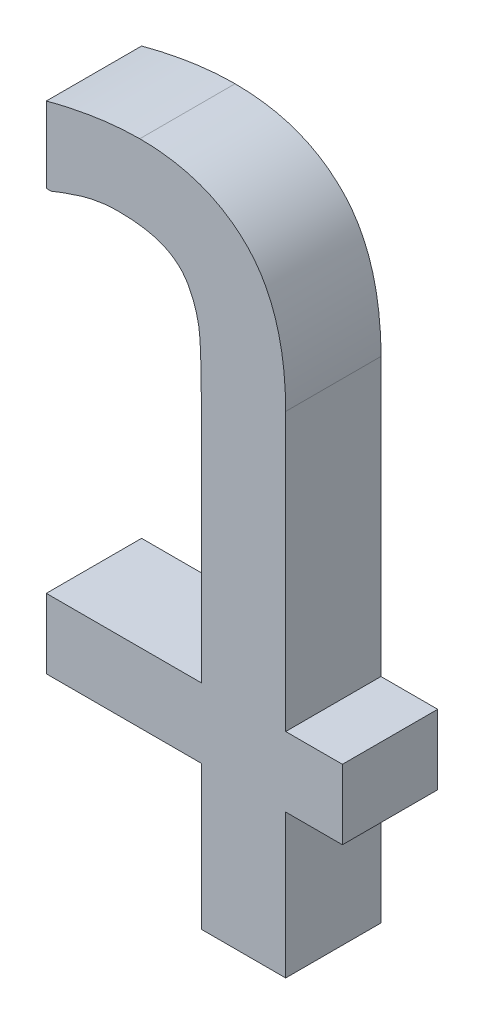
ISO-10303-21;
HEADER;
FILE_DESCRIPTION(('STEP AP214'),'2;1');
FILE_NAME('part.step','',(''),(''),'','','');
FILE_SCHEMA(('AUTOMOTIVE_DESIGN { 1 0 10303 214 1 1 1 1 }'));
ENDSEC;
DATA;
#1=APPLICATION_CONTEXT('core data for automotive mechanical design processes');
#2=APPLICATION_PROTOCOL_DEFINITION('international standard','automotive_design',2000,#1);
#3=PRODUCT_CONTEXT('',#1,'mechanical');
#4=PRODUCT('Part','Part','',(#3));
#5=PRODUCT_RELATED_PRODUCT_CATEGORY('part','',(#4));
#6=PRODUCT_DEFINITION_FORMATION('','',#4);
#7=PRODUCT_DEFINITION_CONTEXT('part definition',#1,'design');
#8=PRODUCT_DEFINITION('design','',#6,#7);
#9=PRODUCT_DEFINITION_SHAPE('','',#8);
#10=(LENGTH_UNIT() NAMED_UNIT(*) SI_UNIT(.MILLI.,.METRE.));
#11=(NAMED_UNIT(*) PLANE_ANGLE_UNIT() SI_UNIT($,.RADIAN.));
#12=(NAMED_UNIT(*) SI_UNIT($,.STERADIAN.) SOLID_ANGLE_UNIT());
#13=UNCERTAINTY_MEASURE_WITH_UNIT(LENGTH_MEASURE(1.E-05),#10,'distance_accuracy_value','');
#14=(GEOMETRIC_REPRESENTATION_CONTEXT(3) GLOBAL_UNCERTAINTY_ASSIGNED_CONTEXT((#13)) GLOBAL_UNIT_ASSIGNED_CONTEXT((#10,
#11,#12)) REPRESENTATION_CONTEXT('',''));
#15=CARTESIAN_POINT('',(0.,0.,0.));
#16=DIRECTION('',(0.,0.,1.));
#17=DIRECTION('',(1.,0.,0.));
#18=AXIS2_PLACEMENT_3D('',#15,#16,#17);
#19=CARTESIAN_POINT('',(-1.909136508596,0.83236047618164,0.));
#20=DIRECTION('',(1.,0.,0.));
#21=DIRECTION('',(0.,1.,0.));
#22=AXIS2_PLACEMENT_3D('',#19,#20,#21);
#23=PLANE('',#22);
#24=DIRECTION('',(0.,-1.,0.));
#25=VECTOR('',#24,1.);
#26=CARTESIAN_POINT('',(-1.909136508596,1.12329883924,0.));
#27=LINE('',#26,#25);
#28=CARTESIAN_POINT('',(-1.909136508596,1.12329883924,0.));
#29=VERTEX_POINT('',#28);
#30=CARTESIAN_POINT('',(-1.909136508596,0.83236047618164,0.));
#31=VERTEX_POINT('',#30);
#32=EDGE_CURVE('E11',#29,#31,#27,.T.);
#33=ORIENTED_EDGE('',*,*,#32,.F.);
#34=DIRECTION('',(0.,0.,1.));
#35=VECTOR('',#34,1.);
#36=CARTESIAN_POINT('',(-1.909136508596,1.12329883924,0.));
#37=LINE('',#36,#35);
#38=CARTESIAN_POINT('',(-1.909136508596,1.12329883924,0.1));
#39=VERTEX_POINT('',#38);
#40=EDGE_CURVE('E24',#29,#39,#37,.T.);
#41=ORIENTED_EDGE('',*,*,#40,.T.);
#42=DIRECTION('',(0.,1.,0.));
#43=VECTOR('',#42,1.);
#44=CARTESIAN_POINT('',(-1.909136508596,1.12329883924,0.1));
#45=LINE('',#44,#43);
#46=CARTESIAN_POINT('',(-1.909136508596,0.83236047618164,0.1));
#47=VERTEX_POINT('',#46);
#48=EDGE_CURVE('E160',#47,#39,#45,.T.);
#49=ORIENTED_EDGE('',*,*,#48,.F.);
#50=DIRECTION('',(0.,0.,1.));
#51=VECTOR('',#50,1.);
#52=CARTESIAN_POINT('',(-1.909136508596,0.83236047618164,0.));
#53=LINE('',#52,#51);
#54=EDGE_CURVE('E331',#31,#47,#53,.T.);
#55=ORIENTED_EDGE('',*,*,#54,.F.);
#56=EDGE_LOOP('',(#33,#41,#49,#55));
#57=FACE_BOUND('',#56,.T.);
#58=ADVANCED_FACE('F17',(#57),#23,.T.);
#59=CARTESIAN_POINT('',(-1.849587720835,0.83236047618164,0.));
#60=DIRECTION('',(0.,1.,0.));
#61=DIRECTION('',(-1.,0.,0.));
#62=AXIS2_PLACEMENT_3D('',#59,#60,#61);
#63=PLANE('',#62);
#64=DIRECTION('',(1.,0.,0.));
#65=VECTOR('',#64,1.);
#66=CARTESIAN_POINT('',(-1.909136508596,0.83236047618164,0.));
#67=LINE('',#66,#65);
#68=CARTESIAN_POINT('',(-1.849587720835,0.83236047618164,0.));
#69=VERTEX_POINT('',#68);
#70=EDGE_CURVE('E329',#31,#69,#67,.T.);
#71=ORIENTED_EDGE('',*,*,#70,.F.);
#72=ORIENTED_EDGE('',*,*,#54,.T.);
#73=DIRECTION('',(-1.,0.,0.));
#74=VECTOR('',#73,1.);
#75=CARTESIAN_POINT('',(-1.909136508596,0.83236047618164,0.1));
#76=LINE('',#75,#74);
#77=CARTESIAN_POINT('',(-1.849587720835,0.83236047618164,0.1));
#78=VERTEX_POINT('',#77);
#79=EDGE_CURVE('E327',#78,#47,#76,.T.);
#80=ORIENTED_EDGE('',*,*,#79,.F.);
#81=DIRECTION('',(0.,0.,1.));
#82=VECTOR('',#81,1.);
#83=CARTESIAN_POINT('',(-1.849587720835,0.83236047618164,0.));
#84=LINE('',#83,#82);
#85=EDGE_CURVE('E324',#69,#78,#84,.T.);
#86=ORIENTED_EDGE('',*,*,#85,.F.);
#87=EDGE_LOOP('',(#71,#72,#80,#86));
#88=FACE_BOUND('',#87,.T.);
#89=ADVANCED_FACE('F393',(#88),#63,.T.);
#90=CARTESIAN_POINT('',(-1.849587720835,0.759200536932928,0.));
#91=DIRECTION('',(1.,0.,0.));
#92=DIRECTION('',(0.,1.,0.));
#93=AXIS2_PLACEMENT_3D('',#90,#91,#92);
#94=PLANE('',#93);
#95=DIRECTION('',(0.,-1.,0.));
#96=VECTOR('',#95,1.);
#97=CARTESIAN_POINT('',(-1.849587720835,0.83236047618164,0.));
#98=LINE('',#97,#96);
#99=CARTESIAN_POINT('',(-1.849587720835,0.759200536932928,0.));
#100=VERTEX_POINT('',#99);
#101=EDGE_CURVE('E322',#69,#100,#98,.T.);
#102=ORIENTED_EDGE('',*,*,#101,.F.);
#103=ORIENTED_EDGE('',*,*,#85,.T.);
#104=DIRECTION('',(0.,1.,0.));
#105=VECTOR('',#104,1.);
#106=CARTESIAN_POINT('',(-1.849587720835,0.83236047618164,0.1));
#107=LINE('',#106,#105);
#108=CARTESIAN_POINT('',(-1.849587720835,0.759200536932928,0.1));
#109=VERTEX_POINT('',#108);
#110=EDGE_CURVE('E319',#109,#78,#107,.T.);
#111=ORIENTED_EDGE('',*,*,#110,.F.);
#112=DIRECTION('',(0.,0.,1.));
#113=VECTOR('',#112,1.);
#114=CARTESIAN_POINT('',(-1.849587720835,0.759200536932928,0.));
#115=LINE('',#114,#113);
#116=EDGE_CURVE('E316',#100,#109,#115,.T.);
#117=ORIENTED_EDGE('',*,*,#116,.F.);
#118=EDGE_LOOP('',(#102,#103,#111,#117));
#119=FACE_BOUND('',#118,.T.);
#120=ADVANCED_FACE('F389',(#119),#94,.T.);
#121=CARTESIAN_POINT('',(-1.909136508596,0.759200536932928,0.));
#122=DIRECTION('',(0.,-1.,0.));
#123=DIRECTION('',(1.,0.,0.));
#124=AXIS2_PLACEMENT_3D('',#121,#122,#123);
#125=PLANE('',#124);
#126=DIRECTION('',(-1.,0.,0.));
#127=VECTOR('',#126,1.);
#128=CARTESIAN_POINT('',(-1.849587720835,0.759200536932928,0.));
#129=LINE('',#128,#127);
#130=CARTESIAN_POINT('',(-1.909136508596,0.759200536932928,0.));
#131=VERTEX_POINT('',#130);
#132=EDGE_CURVE('E314',#100,#131,#129,.T.);
#133=ORIENTED_EDGE('',*,*,#132,.F.);
#134=ORIENTED_EDGE('',*,*,#116,.T.);
#135=DIRECTION('',(1.,0.,0.));
#136=VECTOR('',#135,1.);
#137=CARTESIAN_POINT('',(-1.849587720835,0.759200536932928,0.1));
#138=LINE('',#137,#136);
#139=CARTESIAN_POINT('',(-1.909136508596,0.759200536932928,0.1));
#140=VERTEX_POINT('',#139);
#141=EDGE_CURVE('E311',#140,#109,#138,.T.);
#142=ORIENTED_EDGE('',*,*,#141,.F.);
#143=DIRECTION('',(0.,0.,1.));
#144=VECTOR('',#143,1.);
#145=CARTESIAN_POINT('',(-1.909136508596,0.759200536932928,0.));
#146=LINE('',#145,#144);
#147=EDGE_CURVE('E308',#131,#140,#146,.T.);
#148=ORIENTED_EDGE('',*,*,#147,.F.);
#149=EDGE_LOOP('',(#133,#134,#142,#148));
#150=FACE_BOUND('',#149,.T.);
#151=ADVANCED_FACE('F385',(#150),#125,.T.);
#152=CARTESIAN_POINT('',(-1.909136508596,0.608343607939458,0.));
#153=DIRECTION('',(1.,0.,0.));
#154=DIRECTION('',(0.,1.,0.));
#155=AXIS2_PLACEMENT_3D('',#152,#153,#154);
#156=PLANE('',#155);
#157=DIRECTION('',(0.,-1.,0.));
#158=VECTOR('',#157,1.);
#159=CARTESIAN_POINT('',(-1.909136508596,0.759200536932928,0.));
#160=LINE('',#159,#158);
#161=CARTESIAN_POINT('',(-1.909136508596,0.608343607939458,0.));
#162=VERTEX_POINT('',#161);
#163=EDGE_CURVE('E306',#131,#162,#160,.T.);
#164=ORIENTED_EDGE('',*,*,#163,.F.);
#165=ORIENTED_EDGE('',*,*,#147,.T.);
#166=DIRECTION('',(0.,1.,0.));
#167=VECTOR('',#166,1.);
#168=CARTESIAN_POINT('',(-1.909136508596,0.759200536932928,0.1));
#169=LINE('',#168,#167);
#170=CARTESIAN_POINT('',(-1.909136508596,0.608343607939458,0.1));
#171=VERTEX_POINT('',#170);
#172=EDGE_CURVE('E303',#171,#140,#169,.T.);
#173=ORIENTED_EDGE('',*,*,#172,.F.);
#174=DIRECTION('',(0.,0.,1.));
#175=VECTOR('',#174,1.);
#176=CARTESIAN_POINT('',(-1.909136508596,0.608343607939458,0.));
#177=LINE('',#176,#175);
#178=EDGE_CURVE('E300',#162,#171,#177,.T.);
#179=ORIENTED_EDGE('',*,*,#178,.F.);
#180=EDGE_LOOP('',(#164,#165,#173,#179));
#181=FACE_BOUND('',#180,.T.);
#182=ADVANCED_FACE('F381',(#181),#156,.T.);
#183=CARTESIAN_POINT('',(-1.997608993269,0.608343607939458,0.));
#184=DIRECTION('',(0.,-1.,0.));
#185=DIRECTION('',(1.,0.,0.));
#186=AXIS2_PLACEMENT_3D('',#183,#184,#185);
#187=PLANE('',#186);
#188=DIRECTION('',(-1.,0.,0.));
#189=VECTOR('',#188,1.);
#190=CARTESIAN_POINT('',(-1.909136508596,0.608343607939458,0.));
#191=LINE('',#190,#189);
#192=CARTESIAN_POINT('',(-1.997608993269,0.608343607939458,0.));
#193=VERTEX_POINT('',#192);
#194=EDGE_CURVE('E298',#162,#193,#191,.T.);
#195=ORIENTED_EDGE('',*,*,#194,.F.);
#196=ORIENTED_EDGE('',*,*,#178,.T.);
#197=DIRECTION('',(1.,0.,0.));
#198=VECTOR('',#197,1.);
#199=CARTESIAN_POINT('',(-1.909136508596,0.608343607939458,0.1));
#200=LINE('',#199,#198);
#201=CARTESIAN_POINT('',(-1.997608993269,0.608343607939458,0.1));
#202=VERTEX_POINT('',#201);
#203=EDGE_CURVE('E295',#202,#171,#200,.T.);
#204=ORIENTED_EDGE('',*,*,#203,.F.);
#205=DIRECTION('',(0.,0.,1.));
#206=VECTOR('',#205,1.);
#207=CARTESIAN_POINT('',(-1.997608993269,0.608343607939458,0.));
#208=LINE('',#207,#206);
#209=EDGE_CURVE('E292',#193,#202,#208,.T.);
#210=ORIENTED_EDGE('',*,*,#209,.F.);
#211=EDGE_LOOP('',(#195,#196,#204,#210));
#212=FACE_BOUND('',#211,.T.);
#213=ADVANCED_FACE('F377',(#212),#187,.T.);
#214=CARTESIAN_POINT('',(-1.997608993269,0.759200536932928,0.));
#215=DIRECTION('',(-1.,0.,0.));
#216=DIRECTION('',(0.,-1.,0.));
#217=AXIS2_PLACEMENT_3D('',#214,#215,#216);
#218=PLANE('',#217);
#219=DIRECTION('',(0.,1.,0.));
#220=VECTOR('',#219,1.);
#221=CARTESIAN_POINT('',(-1.997608993269,0.608343607939458,0.));
#222=LINE('',#221,#220);
#223=CARTESIAN_POINT('',(-1.997608993269,0.759200536932928,0.));
#224=VERTEX_POINT('',#223);
#225=EDGE_CURVE('E290',#193,#224,#222,.T.);
#226=ORIENTED_EDGE('',*,*,#225,.F.);
#227=ORIENTED_EDGE('',*,*,#209,.T.);
#228=DIRECTION('',(0.,-1.,0.));
#229=VECTOR('',#228,1.);
#230=CARTESIAN_POINT('',(-1.997608993269,0.608343607939458,0.1));
#231=LINE('',#230,#229);
#232=CARTESIAN_POINT('',(-1.997608993269,0.759200536932928,0.1));
#233=VERTEX_POINT('',#232);
#234=EDGE_CURVE('E287',#233,#202,#231,.T.);
#235=ORIENTED_EDGE('',*,*,#234,.F.);
#236=DIRECTION('',(0.,0.,1.));
#237=VECTOR('',#236,1.);
#238=CARTESIAN_POINT('',(-1.997608993269,0.759200536932928,0.));
#239=LINE('',#238,#237);
#240=EDGE_CURVE('E284',#224,#233,#239,.T.);
#241=ORIENTED_EDGE('',*,*,#240,.F.);
#242=EDGE_LOOP('',(#226,#227,#235,#241));
#243=FACE_BOUND('',#242,.T.);
#244=ADVANCED_FACE('F373',(#243),#218,.T.);
#245=CARTESIAN_POINT('',(-2.160375679814,0.759200536932928,0.));
#246=DIRECTION('',(0.,-1.,0.));
#247=DIRECTION('',(1.,0.,0.));
#248=AXIS2_PLACEMENT_3D('',#245,#246,#247);
#249=PLANE('',#248);
#250=DIRECTION('',(-1.,0.,0.));
#251=VECTOR('',#250,1.);
#252=CARTESIAN_POINT('',(-1.997608993269,0.759200536932928,0.));
#253=LINE('',#252,#251);
#254=CARTESIAN_POINT('',(-2.160375679814,0.759200536932928,0.));
#255=VERTEX_POINT('',#254);
#256=EDGE_CURVE('E282',#224,#255,#253,.T.);
#257=ORIENTED_EDGE('',*,*,#256,.F.);
#258=ORIENTED_EDGE('',*,*,#240,.T.);
#259=DIRECTION('',(1.,0.,0.));
#260=VECTOR('',#259,1.);
#261=CARTESIAN_POINT('',(-1.997608993269,0.759200536932928,0.1));
#262=LINE('',#261,#260);
#263=CARTESIAN_POINT('',(-2.160375679814,0.759200536932928,0.1));
#264=VERTEX_POINT('',#263);
#265=EDGE_CURVE('E279',#264,#233,#262,.T.);
#266=ORIENTED_EDGE('',*,*,#265,.F.);
#267=DIRECTION('',(0.,0.,1.));
#268=VECTOR('',#267,1.);
#269=CARTESIAN_POINT('',(-2.160375679814,0.759200536932928,0.));
#270=LINE('',#269,#268);
#271=EDGE_CURVE('E276',#255,#264,#270,.T.);
#272=ORIENTED_EDGE('',*,*,#271,.F.);
#273=EDGE_LOOP('',(#257,#258,#266,#272));
#274=FACE_BOUND('',#273,.T.);
#275=ADVANCED_FACE('F369',(#274),#249,.T.);
#276=CARTESIAN_POINT('',(-2.160375679814,0.83236047618164,0.));
#277=DIRECTION('',(-1.,0.,0.));
#278=DIRECTION('',(0.,-1.,0.));
#279=AXIS2_PLACEMENT_3D('',#276,#277,#278);
#280=PLANE('',#279);
#281=DIRECTION('',(0.,1.,0.));
#282=VECTOR('',#281,1.);
#283=CARTESIAN_POINT('',(-2.160375679814,0.759200536932928,0.));
#284=LINE('',#283,#282);
#285=CARTESIAN_POINT('',(-2.160375679814,0.83236047618164,0.));
#286=VERTEX_POINT('',#285);
#287=EDGE_CURVE('E274',#255,#286,#284,.T.);
#288=ORIENTED_EDGE('',*,*,#287,.F.);
#289=ORIENTED_EDGE('',*,*,#271,.T.);
#290=DIRECTION('',(0.,-1.,0.));
#291=VECTOR('',#290,1.);
#292=CARTESIAN_POINT('',(-2.160375679814,0.759200536932928,0.1));
#293=LINE('',#292,#291);
#294=CARTESIAN_POINT('',(-2.160375679814,0.83236047618164,0.1));
#295=VERTEX_POINT('',#294);
#296=EDGE_CURVE('E271',#295,#264,#293,.T.);
#297=ORIENTED_EDGE('',*,*,#296,.F.);
#298=DIRECTION('',(0.,0.,1.));
#299=VECTOR('',#298,1.);
#300=CARTESIAN_POINT('',(-2.160375679814,0.83236047618164,0.));
#301=LINE('',#300,#299);
#302=EDGE_CURVE('E268',#286,#295,#301,.T.);
#303=ORIENTED_EDGE('',*,*,#302,.F.);
#304=EDGE_LOOP('',(#288,#289,#297,#303));
#305=FACE_BOUND('',#304,.T.);
#306=ADVANCED_FACE('F365',(#305),#280,.T.);
#307=CARTESIAN_POINT('',(-1.997608993269,0.83236047618164,0.));
#308=DIRECTION('',(0.,1.,0.));
#309=DIRECTION('',(-1.,0.,0.));
#310=AXIS2_PLACEMENT_3D('',#307,#308,#309);
#311=PLANE('',#310);
#312=DIRECTION('',(1.,0.,0.));
#313=VECTOR('',#312,1.);
#314=CARTESIAN_POINT('',(-2.160375679814,0.83236047618164,0.));
#315=LINE('',#314,#313);
#316=CARTESIAN_POINT('',(-1.997608993269,0.83236047618164,0.));
#317=VERTEX_POINT('',#316);
#318=EDGE_CURVE('E266',#286,#317,#315,.T.);
#319=ORIENTED_EDGE('',*,*,#318,.F.);
#320=ORIENTED_EDGE('',*,*,#302,.T.);
#321=DIRECTION('',(-1.,0.,0.));
#322=VECTOR('',#321,1.);
#323=CARTESIAN_POINT('',(-2.160375679814,0.83236047618164,0.1));
#324=LINE('',#323,#322);
#325=CARTESIAN_POINT('',(-1.997608993269,0.83236047618164,0.1));
#326=VERTEX_POINT('',#325);
#327=EDGE_CURVE('E263',#326,#295,#324,.T.);
#328=ORIENTED_EDGE('',*,*,#327,.F.);
#329=DIRECTION('',(0.,0.,1.));
#330=VECTOR('',#329,1.);
#331=CARTESIAN_POINT('',(-1.997608993269,0.83236047618164,0.));
#332=LINE('',#331,#330);
#333=EDGE_CURVE('E260',#317,#326,#332,.T.);
#334=ORIENTED_EDGE('',*,*,#333,.F.);
#335=EDGE_LOOP('',(#319,#320,#328,#334));
#336=FACE_BOUND('',#335,.T.);
#337=ADVANCED_FACE('F361',(#336),#311,.T.);
#338=CARTESIAN_POINT('',(-1.997608993269,1.082465384776,0.));
#339=DIRECTION('',(-1.,0.,0.));
#340=DIRECTION('',(0.,-1.,0.));
#341=AXIS2_PLACEMENT_3D('',#338,#339,#340);
#342=PLANE('',#341);
#343=DIRECTION('',(0.,1.,0.));
#344=VECTOR('',#343,1.);
#345=CARTESIAN_POINT('',(-1.997608993269,0.83236047618164,0.));
#346=LINE('',#345,#344);
#347=CARTESIAN_POINT('',(-1.997608993269,1.082465384776,0.));
#348=VERTEX_POINT('',#347);
#349=EDGE_CURVE('E258',#317,#348,#346,.T.);
#350=ORIENTED_EDGE('',*,*,#349,.F.);
#351=ORIENTED_EDGE('',*,*,#333,.T.);
#352=DIRECTION('',(0.,-1.,0.));
#353=VECTOR('',#352,1.);
#354=CARTESIAN_POINT('',(-1.997608993269,0.83236047618164,0.1));
#355=LINE('',#354,#353);
#356=CARTESIAN_POINT('',(-1.997608993269,1.082465384776,0.1));
#357=VERTEX_POINT('',#356);
#358=EDGE_CURVE('E255',#357,#326,#355,.T.);
#359=ORIENTED_EDGE('',*,*,#358,.F.);
#360=DIRECTION('',(0.,0.,1.));
#361=VECTOR('',#360,1.);
#362=CARTESIAN_POINT('',(-1.997608993269,1.082465384776,0.));
#363=LINE('',#362,#361);
#364=EDGE_CURVE('E249',#348,#357,#363,.T.);
#365=ORIENTED_EDGE('',*,*,#364,.F.);
#366=EDGE_LOOP('',(#350,#351,#359,#365));
#367=FACE_BOUND('',#366,.T.);
#368=ADVANCED_FACE('F357',(#367),#342,.T.);
#369=CARTESIAN_POINT('',(-2.010085882133,1.184549020937,0.));
#370=CARTESIAN_POINT('',(-2.010085882133,1.184549020937,0.1));
#371=CARTESIAN_POINT('',(-2.000444649829,1.165833687641,0.));
#372=CARTESIAN_POINT('',(-2.000444649829,1.165833687641,0.1));
#373=CARTESIAN_POINT('',(-1.997608993269,1.122164576616,0.));
#374=CARTESIAN_POINT('',(-1.997608993269,1.122164576616,0.1));
#375=CARTESIAN_POINT('',(-1.997608993269,1.082465384776,0.));
#376=CARTESIAN_POINT('',(-1.997608993269,1.082465384776,0.1));
#377=B_SPLINE_SURFACE_WITH_KNOTS('',2,1,((#369,#370),(#371,#372),(#373,#374),(#375,#376)),
.UNSPECIFIED.,.F.,.F.,.F.,(3,1,3),(2,2),(-2.,-1.,0.),(0.,0.01),.UNSPECIFIED.);
#378=CARTESIAN_POINT('',(-1.997608993269,1.082465384776,0.));
#379=CARTESIAN_POINT('',(-1.997608993269,1.122164576616,0.));
#380=CARTESIAN_POINT('',(-2.000444649829,1.165833687641,0.));
#381=CARTESIAN_POINT('',(-2.010085882133,1.184549020937,0.));
#382=B_SPLINE_CURVE_WITH_KNOTS('',2,(#378,#379,#380,#381),.UNSPECIFIED.,.F.,.F.,(3,1,3),(0.,1.,
2.),.UNSPECIFIED.);
#383=CARTESIAN_POINT('',(-2.010085882133,1.184549020937,0.));
#384=VERTEX_POINT('',#383);
#385=EDGE_CURVE('E242',#348,#384,#382,.T.);
#386=CARTESIAN_POINT('',(-2.010085882133,1.184549020937,0.1));
#387=CARTESIAN_POINT('',(-2.000444649829,1.165833687641,0.1));
#388=CARTESIAN_POINT('',(-1.997608993269,1.122164576616,0.1));
#389=CARTESIAN_POINT('',(-1.997608993269,1.082465384776,0.1));
#390=B_SPLINE_CURVE_WITH_KNOTS('',2,(#386,#387,#388,#389),.UNSPECIFIED.,.F.,.F.,(3,1,3),(-2.,
-1.,0.),.UNSPECIFIED.);
#391=CARTESIAN_POINT('',(-2.010085882133,1.184549020937,0.1));
#392=VERTEX_POINT('',#391);
#393=EDGE_CURVE('E237',#392,#357,#390,.T.);
#394=DIRECTION('',(0.,0.,1.));
#395=VECTOR('',#394,1.);
#396=CARTESIAN_POINT('',(-2.010085882133,1.184549020937,0.));
#397=LINE('',#396,#395);
#398=EDGE_CURVE('E231',#384,#392,#397,.T.);
#399=ORIENTED_EDGE('',*,*,#385,.F.);
#400=ORIENTED_EDGE('',*,*,#364,.T.);
#401=ORIENTED_EDGE('',*,*,#393,.F.);
#402=ORIENTED_EDGE('',*,*,#398,.F.);
#403=EDGE_LOOP('',(#399,#400,#401,#402));
#404=FACE_BOUND('',#403,.T.);
#405=ADVANCED_FACE('F353',(#404),#377,.T.);
#406=CARTESIAN_POINT('',(-2.084380084006,1.217442637033,0.));
#407=CARTESIAN_POINT('',(-2.084380084006,1.217442637033,0.1));
#408=CARTESIAN_POINT('',(-2.053754993157,1.217442637033,0.));
#409=CARTESIAN_POINT('',(-2.053754993157,1.217442637033,0.1));
#410=CARTESIAN_POINT('',(-2.018025720501,1.200995828985,0.));
#411=CARTESIAN_POINT('',(-2.018025720501,1.200995828985,0.1));
#412=CARTESIAN_POINT('',(-2.010085882133,1.184549020937,0.));
#413=CARTESIAN_POINT('',(-2.010085882133,1.184549020937,0.1));
#414=B_SPLINE_SURFACE_WITH_KNOTS('',2,1,((#406,#407),(#408,#409),(#410,#411),(#412,#413)),
.UNSPECIFIED.,.F.,.F.,.F.,(3,1,3),(2,2),(-2.,-1.,0.),(0.,0.01),.UNSPECIFIED.);
#415=CARTESIAN_POINT('',(-2.010085882133,1.184549020937,0.));
#416=CARTESIAN_POINT('',(-2.018025720501,1.200995828985,0.));
#417=CARTESIAN_POINT('',(-2.053754993157,1.217442637033,0.));
#418=CARTESIAN_POINT('',(-2.084380084006,1.217442637033,0.));
#419=B_SPLINE_CURVE_WITH_KNOTS('',2,(#415,#416,#417,#418),.UNSPECIFIED.,.F.,.F.,(3,1,3),(0.,1.,
2.),.UNSPECIFIED.);
#420=CARTESIAN_POINT('',(-2.084380084006,1.217442637033,0.));
#421=VERTEX_POINT('',#420);
#422=EDGE_CURVE('E224',#384,#421,#419,.T.);
#423=CARTESIAN_POINT('',(-2.084380084006,1.217442637033,0.1));
#424=CARTESIAN_POINT('',(-2.053754993157,1.217442637033,0.1));
#425=CARTESIAN_POINT('',(-2.018025720501,1.200995828985,0.1));
#426=CARTESIAN_POINT('',(-2.010085882133,1.184549020937,0.1));
#427=B_SPLINE_CURVE_WITH_KNOTS('',2,(#423,#424,#425,#426),.UNSPECIFIED.,.F.,.F.,(3,1,3),(-2.,
-1.,0.),.UNSPECIFIED.);
#428=CARTESIAN_POINT('',(-2.084380084006,1.217442637033,0.1));
#429=VERTEX_POINT('',#428);
#430=EDGE_CURVE('E219',#429,#392,#427,.T.);
#431=DIRECTION('',(0.,0.,1.));
#432=VECTOR('',#431,1.);
#433=CARTESIAN_POINT('',(-2.084380084006,1.217442637033,0.));
#434=LINE('',#433,#432);
#435=EDGE_CURVE('E213',#421,#429,#434,.T.);
#436=ORIENTED_EDGE('',*,*,#422,.F.);
#437=ORIENTED_EDGE('',*,*,#398,.T.);
#438=ORIENTED_EDGE('',*,*,#430,.F.);
#439=ORIENTED_EDGE('',*,*,#435,.F.);
#440=EDGE_LOOP('',(#436,#437,#438,#439));
#441=FACE_BOUND('',#440,.T.);
#442=ADVANCED_FACE('F349',(#441),#414,.T.);
#443=CARTESIAN_POINT('',(-2.155271498006,1.200428697673,0.));
#444=CARTESIAN_POINT('',(-2.155271498006,1.200428697673,0.1));
#445=CARTESIAN_POINT('',(-2.146197397014,1.204398616857,0.));
#446=CARTESIAN_POINT('',(-2.146197397014,1.204398616857,0.1));
#447=CARTESIAN_POINT('',(-2.105931073862,1.217442637033,0.));
#448=CARTESIAN_POINT('',(-2.105931073862,1.217442637033,0.1));
#449=CARTESIAN_POINT('',(-2.084380084006,1.217442637033,0.));
#450=CARTESIAN_POINT('',(-2.084380084006,1.217442637033,0.1));
#451=B_SPLINE_SURFACE_WITH_KNOTS('',2,1,((#443,#444),(#445,#446),(#447,#448),(#449,#450)),
.UNSPECIFIED.,.F.,.F.,.F.,(3,1,3),(2,2),(-2.,-1.,0.),(0.,0.01),.UNSPECIFIED.);
#452=CARTESIAN_POINT('',(-2.084380084006,1.217442637033,0.));
#453=CARTESIAN_POINT('',(-2.105931073862,1.217442637033,0.));
#454=CARTESIAN_POINT('',(-2.146197397014,1.204398616857,0.));
#455=CARTESIAN_POINT('',(-2.155271498006,1.200428697673,0.));
#456=B_SPLINE_CURVE_WITH_KNOTS('',2,(#452,#453,#454,#455),.UNSPECIFIED.,.F.,.F.,(3,1,3),(0.,1.,
2.),.UNSPECIFIED.);
#457=CARTESIAN_POINT('',(-2.155271498006,1.200428697673,0.));
#458=VERTEX_POINT('',#457);
#459=EDGE_CURVE('E206',#421,#458,#456,.T.);
#460=CARTESIAN_POINT('',(-2.155271498006,1.200428697673,0.1));
#461=CARTESIAN_POINT('',(-2.146197397014,1.204398616857,0.1));
#462=CARTESIAN_POINT('',(-2.105931073862,1.217442637033,0.1));
#463=CARTESIAN_POINT('',(-2.084380084006,1.217442637033,0.1));
#464=B_SPLINE_CURVE_WITH_KNOTS('',2,(#460,#461,#462,#463),.UNSPECIFIED.,.F.,.F.,(3,1,3),(-2.,
-1.,0.),.UNSPECIFIED.);
#465=CARTESIAN_POINT('',(-2.155271498006,1.200428697673,0.1));
#466=VERTEX_POINT('',#465);
#467=EDGE_CURVE('E201',#466,#429,#464,.T.);
#468=DIRECTION('',(0.,0.,1.));
#469=VECTOR('',#468,1.);
#470=CARTESIAN_POINT('',(-2.155271498006,1.200428697673,0.));
#471=LINE('',#470,#469);
#472=EDGE_CURVE('E198',#458,#466,#471,.T.);
#473=ORIENTED_EDGE('',*,*,#459,.F.);
#474=ORIENTED_EDGE('',*,*,#435,.T.);
#475=ORIENTED_EDGE('',*,*,#467,.F.);
#476=ORIENTED_EDGE('',*,*,#472,.F.);
#477=EDGE_LOOP('',(#473,#474,#475,#476));
#478=FACE_BOUND('',#477,.T.);
#479=ADVANCED_FACE('F345',(#478),#451,.T.);
#480=CARTESIAN_POINT('',(-2.160375679814,1.200428697673,0.));
#481=DIRECTION('',(0.,-1.,0.));
#482=DIRECTION('',(1.,0.,0.));
#483=AXIS2_PLACEMENT_3D('',#480,#481,#482);
#484=PLANE('',#483);
#485=DIRECTION('',(-1.,0.,0.));
#486=VECTOR('',#485,1.);
#487=CARTESIAN_POINT('',(-2.155271498006,1.200428697673,0.));
#488=LINE('',#487,#486);
#489=CARTESIAN_POINT('',(-2.160375679814,1.200428697673,0.));
#490=VERTEX_POINT('',#489);
#491=EDGE_CURVE('E196',#458,#490,#488,.T.);
#492=ORIENTED_EDGE('',*,*,#491,.F.);
#493=ORIENTED_EDGE('',*,*,#472,.T.);
#494=DIRECTION('',(1.,0.,0.));
#495=VECTOR('',#494,1.);
#496=CARTESIAN_POINT('',(-2.155271498006,1.200428697673,0.1));
#497=LINE('',#496,#495);
#498=CARTESIAN_POINT('',(-2.160375679814,1.200428697673,0.1));
#499=VERTEX_POINT('',#498);
#500=EDGE_CURVE('E193',#499,#466,#497,.T.);
#501=ORIENTED_EDGE('',*,*,#500,.F.);
#502=DIRECTION('',(0.,0.,1.));
#503=VECTOR('',#502,1.);
#504=CARTESIAN_POINT('',(-2.160375679814,1.200428697673,0.));
#505=LINE('',#504,#503);
#506=EDGE_CURVE('E190',#490,#499,#505,.T.);
#507=ORIENTED_EDGE('',*,*,#506,.F.);
#508=EDGE_LOOP('',(#492,#493,#501,#507));
#509=FACE_BOUND('',#508,.T.);
#510=ADVANCED_FACE('F341',(#509),#484,.T.);
#511=CARTESIAN_POINT('',(-2.160375679814,1.279827081354,0.));
#512=DIRECTION('',(-1.,0.,0.));
#513=DIRECTION('',(0.,-1.,0.));
#514=AXIS2_PLACEMENT_3D('',#511,#512,#513);
#515=PLANE('',#514);
#516=DIRECTION('',(0.,1.,0.));
#517=VECTOR('',#516,1.);
#518=CARTESIAN_POINT('',(-2.160375679814,1.200428697673,0.));
#519=LINE('',#518,#517);
#520=CARTESIAN_POINT('',(-2.160375679814,1.279827081354,0.));
#521=VERTEX_POINT('',#520);
#522=EDGE_CURVE('E188',#490,#521,#519,.T.);
#523=ORIENTED_EDGE('',*,*,#522,.F.);
#524=ORIENTED_EDGE('',*,*,#506,.T.);
#525=DIRECTION('',(0.,-1.,0.));
#526=VECTOR('',#525,1.);
#527=CARTESIAN_POINT('',(-2.160375679814,1.200428697673,0.1));
#528=LINE('',#527,#526);
#529=CARTESIAN_POINT('',(-2.160375679814,1.279827081354,0.1));
#530=VERTEX_POINT('',#529);
#531=EDGE_CURVE('E186',#530,#499,#528,.T.);
#532=ORIENTED_EDGE('',*,*,#531,.F.);
#533=DIRECTION('',(0.,0.,1.));
#534=VECTOR('',#533,1.);
#535=CARTESIAN_POINT('',(-2.160375679814,1.279827081354,0.));
#536=LINE('',#535,#534);
#537=EDGE_CURVE('E145',#521,#530,#536,.T.);
#538=ORIENTED_EDGE('',*,*,#537,.F.);
#539=EDGE_LOOP('',(#523,#524,#532,#538));
#540=FACE_BOUND('',#539,.T.);
#541=ADVANCED_FACE('F339',(#540),#515,.T.);
#542=CARTESIAN_POINT('',(-2.062261962837,1.294572495466,0.));
#543=CARTESIAN_POINT('',(-2.062261962837,1.294572495466,0.1));
#544=CARTESIAN_POINT('',(-2.084380084006,1.294572495466,0.));
#545=CARTESIAN_POINT('',(-2.084380084006,1.294572495466,0.1));
#546=CARTESIAN_POINT('',(-2.135421902086,1.286632657098,0.));
#547=CARTESIAN_POINT('',(-2.135421902086,1.286632657098,0.1));
#548=CARTESIAN_POINT('',(-2.160375679814,1.279827081354,0.));
#549=CARTESIAN_POINT('',(-2.160375679814,1.279827081354,0.1));
#550=B_SPLINE_SURFACE_WITH_KNOTS('',2,1,((#542,#543),(#544,#545),(#546,#547),(#548,#549)),
.UNSPECIFIED.,.F.,.F.,.F.,(3,1,3),(2,2),(-2.,-1.,0.),(0.,0.01),.UNSPECIFIED.);
#551=CARTESIAN_POINT('',(-2.160375679814,1.279827081354,0.));
#552=CARTESIAN_POINT('',(-2.135421902086,1.286632657098,0.));
#553=CARTESIAN_POINT('',(-2.084380084006,1.294572495466,0.));
#554=CARTESIAN_POINT('',(-2.062261962837,1.294572495466,0.));
#555=B_SPLINE_CURVE_WITH_KNOTS('',2,(#551,#552,#553,#554),.UNSPECIFIED.,.F.,.F.,(3,1,3),(0.,1.,
2.),.UNSPECIFIED.);
#556=CARTESIAN_POINT('',(-2.062261962837,1.294572495466,0.));
#557=VERTEX_POINT('',#556);
#558=EDGE_CURVE('E149',#521,#557,#555,.T.);
#559=CARTESIAN_POINT('',(-2.062261962837,1.294572495466,0.1));
#560=CARTESIAN_POINT('',(-2.084380084006,1.294572495466,0.1));
#561=CARTESIAN_POINT('',(-2.135421902086,1.286632657098,0.1));
#562=CARTESIAN_POINT('',(-2.160375679814,1.279827081354,0.1));
#563=B_SPLINE_CURVE_WITH_KNOTS('',2,(#559,#560,#561,#562),.UNSPECIFIED.,.F.,.F.,(3,1,3),(-2.,
-1.,0.),.UNSPECIFIED.);
#564=CARTESIAN_POINT('',(-2.062261962837,1.294572495466,0.1));
#565=VERTEX_POINT('',#564);
#566=EDGE_CURVE('E138',#565,#530,#563,.T.);
#567=DIRECTION('',(0.,0.,1.));
#568=VECTOR('',#567,1.);
#569=CARTESIAN_POINT('',(-2.062261962837,1.294572495466,0.));
#570=LINE('',#569,#568);
#571=EDGE_CURVE('E142',#557,#565,#570,.T.);
#572=ORIENTED_EDGE('',*,*,#558,.F.);
#573=ORIENTED_EDGE('',*,*,#537,.T.);
#574=ORIENTED_EDGE('',*,*,#566,.F.);
#575=ORIENTED_EDGE('',*,*,#571,.F.);
#576=EDGE_LOOP('',(#572,#573,#574,#575));
#577=FACE_BOUND('',#576,.T.);
#578=ADVANCED_FACE('F141',(#577),#550,.T.);
#579=CARTESIAN_POINT('',(-1.909136508596,1.12329883924,0.));
#580=CARTESIAN_POINT('',(-1.909136508596,1.12329883924,0.1));
#581=CARTESIAN_POINT('',(-1.909136508596,1.212338455225,0.));
#582=CARTESIAN_POINT('',(-1.909136508596,1.212338455225,0.1));
#583=CARTESIAN_POINT('',(-1.990236286213,1.294572495466,0.));
#584=CARTESIAN_POINT('',(-1.990236286213,1.294572495466,0.1));
#585=CARTESIAN_POINT('',(-2.062261962837,1.294572495466,0.));
#586=CARTESIAN_POINT('',(-2.062261962837,1.294572495466,0.1));
#587=B_SPLINE_SURFACE_WITH_KNOTS('',2,1,((#579,#580),(#581,#582),(#583,#584),(#585,#586)),
.UNSPECIFIED.,.F.,.F.,.F.,(3,1,3),(2,2),(-2.,-1.,0.),(0.,0.01),.UNSPECIFIED.);
#588=CARTESIAN_POINT('',(-2.062261962837,1.294572495466,0.));
#589=CARTESIAN_POINT('',(-1.990236286213,1.294572495466,0.));
#590=CARTESIAN_POINT('',(-1.909136508596,1.212338455225,0.));
#591=CARTESIAN_POINT('',(-1.909136508596,1.12329883924,0.));
#592=B_SPLINE_CURVE_WITH_KNOTS('',2,(#588,#589,#590,#591),.UNSPECIFIED.,.F.,.F.,(3,1,3),(0.,1.,
2.),.UNSPECIFIED.);
#593=EDGE_CURVE('E155',#557,#29,#592,.T.);
#594=CARTESIAN_POINT('',(-1.909136508596,1.12329883924,0.1));
#595=CARTESIAN_POINT('',(-1.909136508596,1.212338455225,0.1));
#596=CARTESIAN_POINT('',(-1.990236286213,1.294572495466,0.1));
#597=CARTESIAN_POINT('',(-2.062261962837,1.294572495466,0.1));
#598=B_SPLINE_CURVE_WITH_KNOTS('',2,(#594,#595,#596,#597),.UNSPECIFIED.,.F.,.F.,(3,1,3),(-2.,
-1.,0.),.UNSPECIFIED.);
#599=EDGE_CURVE('E154',#39,#565,#598,.T.);
#600=ORIENTED_EDGE('',*,*,#593,.F.);
#601=ORIENTED_EDGE('',*,*,#571,.T.);
#602=ORIENTED_EDGE('',*,*,#599,.F.);
#603=ORIENTED_EDGE('',*,*,#40,.F.);
#604=EDGE_LOOP('',(#600,#601,#602,#603));
#605=FACE_BOUND('',#604,.T.);
#606=ADVANCED_FACE('F153',(#605),#587,.T.);
#607=CARTESIAN_POINT('',(-1.995267949387,0.930351300511719,0.));
#608=DIRECTION('',(0.,0.,1.));
#609=DIRECTION('',(1.,0.,0.));
#610=AXIS2_PLACEMENT_3D('',#607,#608,#609);
#611=PLANE('',#610);
#612=ORIENTED_EDGE('',*,*,#593,.T.);
#613=ORIENTED_EDGE('',*,*,#32,.T.);
#614=ORIENTED_EDGE('',*,*,#70,.T.);
#615=ORIENTED_EDGE('',*,*,#101,.T.);
#616=ORIENTED_EDGE('',*,*,#132,.T.);
#617=ORIENTED_EDGE('',*,*,#163,.T.);
#618=ORIENTED_EDGE('',*,*,#194,.T.);
#619=ORIENTED_EDGE('',*,*,#225,.T.);
#620=ORIENTED_EDGE('',*,*,#256,.T.);
#621=ORIENTED_EDGE('',*,*,#287,.T.);
#622=ORIENTED_EDGE('',*,*,#318,.T.);
#623=ORIENTED_EDGE('',*,*,#349,.T.);
#624=ORIENTED_EDGE('',*,*,#385,.T.);
#625=ORIENTED_EDGE('',*,*,#422,.T.);
#626=ORIENTED_EDGE('',*,*,#459,.T.);
#627=ORIENTED_EDGE('',*,*,#491,.T.);
#628=ORIENTED_EDGE('',*,*,#522,.T.);
#629=ORIENTED_EDGE('',*,*,#558,.T.);
#630=EDGE_LOOP('',(#612,#613,#614,#615,#616,#617,#618,#619,#620,#621,#622,#623,#624,#625,#626,
#627,#628,#629));
#631=FACE_BOUND('',#630,.T.);
#632=ADVANCED_FACE('F334',(#631),#611,.F.);
#633=CARTESIAN_POINT('',(-1.995267949387,0.930351300511719,0.1));
#634=DIRECTION('',(0.,0.,1.));
#635=DIRECTION('',(1.,0.,0.));
#636=AXIS2_PLACEMENT_3D('',#633,#634,#635);
#637=PLANE('',#636);
#638=ORIENTED_EDGE('',*,*,#599,.T.);
#639=ORIENTED_EDGE('',*,*,#566,.T.);
#640=ORIENTED_EDGE('',*,*,#531,.T.);
#641=ORIENTED_EDGE('',*,*,#500,.T.);
#642=ORIENTED_EDGE('',*,*,#467,.T.);
#643=ORIENTED_EDGE('',*,*,#430,.T.);
#644=ORIENTED_EDGE('',*,*,#393,.T.);
#645=ORIENTED_EDGE('',*,*,#358,.T.);
#646=ORIENTED_EDGE('',*,*,#327,.T.);
#647=ORIENTED_EDGE('',*,*,#296,.T.);
#648=ORIENTED_EDGE('',*,*,#265,.T.);
#649=ORIENTED_EDGE('',*,*,#234,.T.);
#650=ORIENTED_EDGE('',*,*,#203,.T.);
#651=ORIENTED_EDGE('',*,*,#172,.T.);
#652=ORIENTED_EDGE('',*,*,#141,.T.);
#653=ORIENTED_EDGE('',*,*,#110,.T.);
#654=ORIENTED_EDGE('',*,*,#79,.T.);
#655=ORIENTED_EDGE('',*,*,#48,.T.);
#656=EDGE_LOOP('',(#638,#639,#640,#641,#642,#643,#644,#645,#646,#647,#648,#649,#650,#651,#652,
#653,#654,#655));
#657=FACE_BOUND('',#656,.T.);
#658=ADVANCED_FACE('F158',(#657),#637,.T.);
#659=CLOSED_SHELL('',(#58,#89,#120,#151,#182,#213,#244,#275,#306,#337,#368,#405,#442,#479,#510,
#541,#578,#606,#632,#658));
#660=MANIFOLD_SOLID_BREP('B1',#659);
#661=ADVANCED_BREP_SHAPE_REPRESENTATION('',(#18,#660),#14);
#662=SHAPE_DEFINITION_REPRESENTATION(#9,#661);
ENDSEC;
END-ISO-10303-21;
